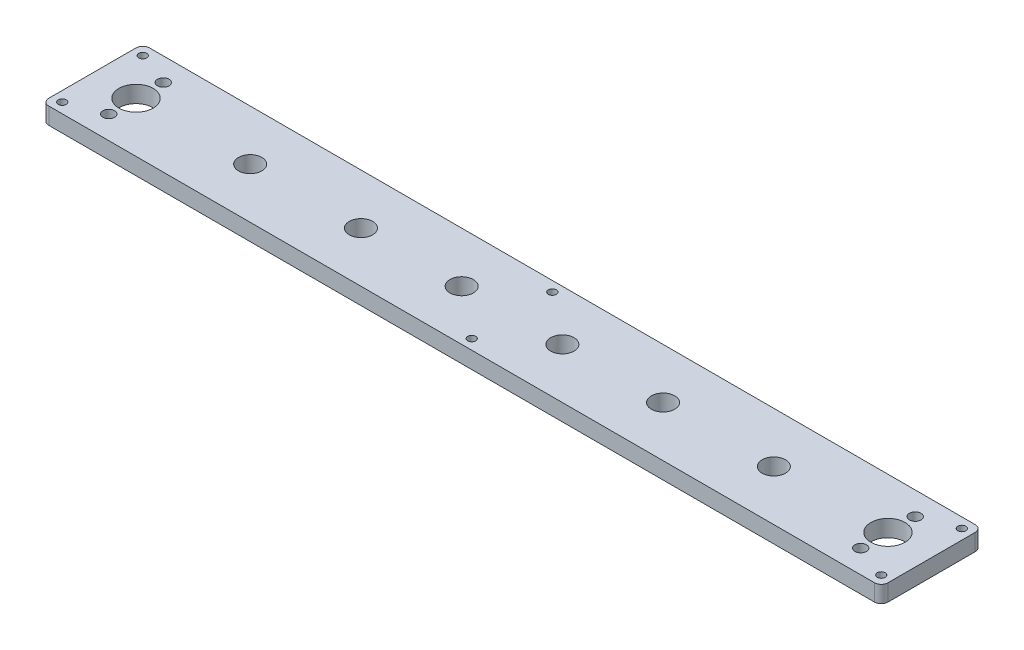
ISO-10303-21;
HEADER;
FILE_DESCRIPTION(('STEP AP214'),'2;1');
FILE_NAME('part.step','',(''),(''),'','','');
FILE_SCHEMA(('AUTOMOTIVE_DESIGN { 1 0 10303 214 1 1 1 1 }'));
ENDSEC;
DATA;
#1=APPLICATION_CONTEXT('core data for automotive mechanical design processes');
#2=APPLICATION_PROTOCOL_DEFINITION('international standard','automotive_design',2000,#1);
#3=PRODUCT_CONTEXT('',#1,'mechanical');
#4=PRODUCT('Part','Part','',(#3));
#5=PRODUCT_RELATED_PRODUCT_CATEGORY('part','',(#4));
#6=PRODUCT_DEFINITION_FORMATION('','',#4);
#7=PRODUCT_DEFINITION_CONTEXT('part definition',#1,'design');
#8=PRODUCT_DEFINITION('design','',#6,#7);
#9=PRODUCT_DEFINITION_SHAPE('','',#8);
#10=(LENGTH_UNIT() NAMED_UNIT(*) SI_UNIT(.MILLI.,.METRE.));
#11=(NAMED_UNIT(*) PLANE_ANGLE_UNIT() SI_UNIT($,.RADIAN.));
#12=(NAMED_UNIT(*) SI_UNIT($,.STERADIAN.) SOLID_ANGLE_UNIT());
#13=UNCERTAINTY_MEASURE_WITH_UNIT(LENGTH_MEASURE(1.E-05),#10,'distance_accuracy_value','');
#14=(GEOMETRIC_REPRESENTATION_CONTEXT(3) GLOBAL_UNCERTAINTY_ASSIGNED_CONTEXT((#13)) GLOBAL_UNIT_ASSIGNED_CONTEXT((#10,
#11,#12)) REPRESENTATION_CONTEXT('',''));
#15=CARTESIAN_POINT('',(0.,0.,0.));
#16=DIRECTION('',(0.,0.,1.));
#17=DIRECTION('',(1.,0.,0.));
#18=AXIS2_PLACEMENT_3D('',#15,#16,#17);
#19=CARTESIAN_POINT('',(158.75,3.175,19.05));
#20=DIRECTION('',(-1.,0.,0.));
#21=DIRECTION('',(0.,0.,1.));
#22=AXIS2_PLACEMENT_3D('',#19,#20,#21);
#23=PLANE('',#22);
#24=DIRECTION('',(0.,0.,-1.));
#25=VECTOR('',#24,1.);
#26=CARTESIAN_POINT('',(158.75,3.175,19.05));
#27=LINE('',#26,#25);
#28=CARTESIAN_POINT('',(158.75,3.175,16.51));
#29=VERTEX_POINT('',#28);
#30=CARTESIAN_POINT('',(158.75,3.175,-16.51));
#31=VERTEX_POINT('',#30);
#32=EDGE_CURVE('E125',#29,#31,#27,.T.);
#33=ORIENTED_EDGE('',*,*,#32,.F.);
#34=DIRECTION('',(0.,-1.,0.));
#35=VECTOR('',#34,1.);
#36=CARTESIAN_POINT('',(158.75,3.175,16.51));
#37=LINE('',#36,#35);
#38=CARTESIAN_POINT('',(158.75,-3.175,16.51));
#39=VERTEX_POINT('',#38);
#40=EDGE_CURVE('E110',#29,#39,#37,.T.);
#41=ORIENTED_EDGE('',*,*,#40,.T.);
#42=DIRECTION('',(0.,0.,-1.));
#43=VECTOR('',#42,1.);
#44=CARTESIAN_POINT('',(158.75,-3.175,19.05));
#45=LINE('',#44,#43);
#46=CARTESIAN_POINT('',(158.75,-3.175,-16.51));
#47=VERTEX_POINT('',#46);
#48=EDGE_CURVE('E122',#39,#47,#45,.T.);
#49=ORIENTED_EDGE('',*,*,#48,.T.);
#50=DIRECTION('',(0.,-1.,0.));
#51=VECTOR('',#50,1.);
#52=CARTESIAN_POINT('',(158.75,3.175,-16.51));
#53=LINE('',#52,#51);
#54=EDGE_CURVE('E127',#47,#31,#53,.F.);
#55=ORIENTED_EDGE('',*,*,#54,.T.);
#56=EDGE_LOOP('',(#33,#41,#49,#55));
#57=FACE_BOUND('',#56,.T.);
#58=ADVANCED_FACE('F39',(#57),#23,.F.);
#59=CARTESIAN_POINT('',(-158.75,3.175,-19.05));
#60=DIRECTION('',(0.,0.,1.));
#61=DIRECTION('',(1.,0.,0.));
#62=AXIS2_PLACEMENT_3D('',#59,#60,#61);
#63=PLANE('',#62);
#64=DIRECTION('',(-1.,0.,0.));
#65=VECTOR('',#64,1.);
#66=CARTESIAN_POINT('',(-158.75,3.175,-19.05));
#67=LINE('',#66,#65);
#68=CARTESIAN_POINT('',(156.21,3.175,-19.05));
#69=VERTEX_POINT('',#68);
#70=CARTESIAN_POINT('',(-156.21,3.175,-19.05));
#71=VERTEX_POINT('',#70);
#72=EDGE_CURVE('E169',#69,#71,#67,.T.);
#73=ORIENTED_EDGE('',*,*,#72,.F.);
#74=DIRECTION('',(0.,-1.,0.));
#75=VECTOR('',#74,1.);
#76=CARTESIAN_POINT('',(156.21,3.175,-19.05));
#77=LINE('',#76,#75);
#78=CARTESIAN_POINT('',(156.21,-3.175,-19.05));
#79=VERTEX_POINT('',#78);
#80=EDGE_CURVE('E11',#69,#79,#77,.T.);
#81=ORIENTED_EDGE('',*,*,#80,.T.);
#82=DIRECTION('',(-1.,0.,0.));
#83=VECTOR('',#82,1.);
#84=CARTESIAN_POINT('',(-158.75,-3.175,-19.05));
#85=LINE('',#84,#83);
#86=CARTESIAN_POINT('',(-156.21,-3.175,-19.05));
#87=VERTEX_POINT('',#86);
#88=EDGE_CURVE('E132',#79,#87,#85,.T.);
#89=ORIENTED_EDGE('',*,*,#88,.T.);
#90=DIRECTION('',(0.,-1.,0.));
#91=VECTOR('',#90,1.);
#92=CARTESIAN_POINT('',(-156.21,3.175,-19.05));
#93=LINE('',#92,#91);
#94=EDGE_CURVE('E47',#87,#71,#93,.F.);
#95=ORIENTED_EDGE('',*,*,#94,.T.);
#96=EDGE_LOOP('',(#73,#81,#89,#95));
#97=FACE_BOUND('',#96,.T.);
#98=ADVANCED_FACE('F168',(#97),#63,.F.);
#99=CARTESIAN_POINT('',(-158.75,3.175,19.05));
#100=DIRECTION('',(1.,0.,0.));
#101=DIRECTION('',(0.,0.,-1.));
#102=AXIS2_PLACEMENT_3D('',#99,#100,#101);
#103=PLANE('',#102);
#104=DIRECTION('',(0.,0.,1.));
#105=VECTOR('',#104,1.);
#106=CARTESIAN_POINT('',(-158.75,-3.175,19.05));
#107=LINE('',#106,#105);
#108=CARTESIAN_POINT('',(-158.75,-3.175,-16.51));
#109=VERTEX_POINT('',#108);
#110=CARTESIAN_POINT('',(-158.75,-3.175,16.51));
#111=VERTEX_POINT('',#110);
#112=EDGE_CURVE('E136',#109,#111,#107,.T.);
#113=ORIENTED_EDGE('',*,*,#112,.T.);
#114=DIRECTION('',(0.,-1.,0.));
#115=VECTOR('',#114,1.);
#116=CARTESIAN_POINT('',(-158.75,3.175,16.51));
#117=LINE('',#116,#115);
#118=CARTESIAN_POINT('',(-158.75,3.175,16.51));
#119=VERTEX_POINT('',#118);
#120=EDGE_CURVE('E54',#111,#119,#117,.F.);
#121=ORIENTED_EDGE('',*,*,#120,.T.);
#122=DIRECTION('',(0.,0.,1.));
#123=VECTOR('',#122,1.);
#124=CARTESIAN_POINT('',(-158.75,3.175,19.05));
#125=LINE('',#124,#123);
#126=CARTESIAN_POINT('',(-158.75,3.175,-16.51));
#127=VERTEX_POINT('',#126);
#128=EDGE_CURVE('E175',#127,#119,#125,.T.);
#129=ORIENTED_EDGE('',*,*,#128,.F.);
#130=DIRECTION('',(0.,-1.,0.));
#131=VECTOR('',#130,1.);
#132=CARTESIAN_POINT('',(-158.75,3.175,-16.51));
#133=LINE('',#132,#131);
#134=EDGE_CURVE('E162',#127,#109,#133,.T.);
#135=ORIENTED_EDGE('',*,*,#134,.T.);
#136=EDGE_LOOP('',(#113,#121,#129,#135));
#137=FACE_BOUND('',#136,.T.);
#138=ADVANCED_FACE('F179',(#137),#103,.F.);
#139=CARTESIAN_POINT('',(-158.75,3.175,19.05));
#140=DIRECTION('',(0.,0.,-1.));
#141=DIRECTION('',(-1.,0.,0.));
#142=AXIS2_PLACEMENT_3D('',#139,#140,#141);
#143=PLANE('',#142);
#144=DIRECTION('',(1.,0.,0.));
#145=VECTOR('',#144,1.);
#146=CARTESIAN_POINT('',(-158.75,-3.175,19.05));
#147=LINE('',#146,#145);
#148=CARTESIAN_POINT('',(-156.21,-3.175,19.05));
#149=VERTEX_POINT('',#148);
#150=CARTESIAN_POINT('',(156.21,-3.175,19.05));
#151=VERTEX_POINT('',#150);
#152=EDGE_CURVE('E146',#149,#151,#147,.T.);
#153=ORIENTED_EDGE('',*,*,#152,.T.);
#154=DIRECTION('',(0.,-1.,0.));
#155=VECTOR('',#154,1.);
#156=CARTESIAN_POINT('',(156.21,3.175,19.05));
#157=LINE('',#156,#155);
#158=CARTESIAN_POINT('',(156.21,3.175,19.05));
#159=VERTEX_POINT('',#158);
#160=EDGE_CURVE('E111',#151,#159,#157,.F.);
#161=ORIENTED_EDGE('',*,*,#160,.T.);
#162=DIRECTION('',(1.,0.,0.));
#163=VECTOR('',#162,1.);
#164=CARTESIAN_POINT('',(-158.75,3.175,19.05));
#165=LINE('',#164,#163);
#166=CARTESIAN_POINT('',(-156.21,3.175,19.05));
#167=VERTEX_POINT('',#166);
#168=EDGE_CURVE('E142',#167,#159,#165,.T.);
#169=ORIENTED_EDGE('',*,*,#168,.F.);
#170=DIRECTION('',(0.,-1.,0.));
#171=VECTOR('',#170,1.);
#172=CARTESIAN_POINT('',(-156.21,3.175,19.05));
#173=LINE('',#172,#171);
#174=EDGE_CURVE('E116',#167,#149,#173,.T.);
#175=ORIENTED_EDGE('',*,*,#174,.T.);
#176=EDGE_LOOP('',(#153,#161,#169,#175));
#177=FACE_BOUND('',#176,.T.);
#178=ADVANCED_FACE('F186',(#177),#143,.F.);
#179=CARTESIAN_POINT('',(0.,3.175,0.));
#180=DIRECTION('',(0.,-1.,0.));
#181=DIRECTION('',(0.,0.,-1.));
#182=AXIS2_PLACEMENT_3D('',#179,#180,#181);
#183=PLANE('',#182);
#184=CARTESIAN_POINT('',(0.,3.175,15.24));
#185=DIRECTION('',(0.,1.,0.));
#186=DIRECTION('',(0.,0.,1.));
#187=AXIS2_PLACEMENT_3D('',#184,#185,#186);
#188=CIRCLE('',#187,1.5113);
#189=CARTESIAN_POINT('',(0.,3.175,16.7513));
#190=VERTEX_POINT('',#189);
#191=EDGE_CURVE('E276',#190,#190,#188,.T.);
#192=ORIENTED_EDGE('',*,*,#191,.F.);
#193=EDGE_LOOP('',(#192));
#194=FACE_BOUND('',#193,.T.);
#195=CARTESIAN_POINT('',(0.,3.175,-15.24));
#196=DIRECTION('',(0.,1.,0.));
#197=DIRECTION('',(0.,0.,1.));
#198=AXIS2_PLACEMENT_3D('',#195,#196,#197);
#199=CIRCLE('',#198,1.5113);
#200=CARTESIAN_POINT('',(0.,3.175,-13.7287));
#201=VERTEX_POINT('',#200);
#202=EDGE_CURVE('E282',#201,#201,#199,.T.);
#203=ORIENTED_EDGE('',*,*,#202,.F.);
#204=EDGE_LOOP('',(#203));
#205=FACE_BOUND('',#204,.T.);
#206=CARTESIAN_POINT('',(154.94,3.175,-15.24));
#207=DIRECTION('',(0.,1.,0.));
#208=DIRECTION('',(0.,0.,1.));
#209=AXIS2_PLACEMENT_3D('',#206,#207,#208);
#210=CIRCLE('',#209,1.5113);
#211=CARTESIAN_POINT('',(154.94,3.175,-13.7287));
#212=VERTEX_POINT('',#211);
#213=EDGE_CURVE('E288',#212,#212,#210,.T.);
#214=ORIENTED_EDGE('',*,*,#213,.F.);
#215=EDGE_LOOP('',(#214));
#216=FACE_BOUND('',#215,.T.);
#217=CARTESIAN_POINT('',(154.94,3.175,15.24));
#218=DIRECTION('',(0.,1.,0.));
#219=DIRECTION('',(0.,0.,1.));
#220=AXIS2_PLACEMENT_3D('',#217,#218,#219);
#221=CIRCLE('',#220,1.5113);
#222=CARTESIAN_POINT('',(154.94,3.175,16.7513));
#223=VERTEX_POINT('',#222);
#224=EDGE_CURVE('E264',#223,#223,#221,.T.);
#225=ORIENTED_EDGE('',*,*,#224,.F.);
#226=EDGE_LOOP('',(#225));
#227=FACE_BOUND('',#226,.T.);
#228=CARTESIAN_POINT('',(-154.94,3.175,15.24));
#229=DIRECTION('',(0.,1.,0.));
#230=DIRECTION('',(0.,0.,1.));
#231=AXIS2_PLACEMENT_3D('',#228,#229,#230);
#232=CIRCLE('',#231,1.5113);
#233=CARTESIAN_POINT('',(-154.94,3.175,16.7513));
#234=VERTEX_POINT('',#233);
#235=EDGE_CURVE('E271',#234,#234,#232,.T.);
#236=ORIENTED_EDGE('',*,*,#235,.F.);
#237=EDGE_LOOP('',(#236));
#238=FACE_BOUND('',#237,.T.);
#239=CARTESIAN_POINT('',(-154.94,3.175,-15.24));
#240=DIRECTION('',(0.,1.,0.));
#241=DIRECTION('',(0.,0.,1.));
#242=AXIS2_PLACEMENT_3D('',#239,#240,#241);
#243=CIRCLE('',#242,1.5113);
#244=CARTESIAN_POINT('',(-154.94,3.175,-13.7287));
#245=VERTEX_POINT('',#244);
#246=EDGE_CURVE('E258',#245,#245,#243,.T.);
#247=ORIENTED_EDGE('',*,*,#246,.F.);
#248=EDGE_LOOP('',(#247));
#249=FACE_BOUND('',#248,.T.);
#250=CARTESIAN_POINT('',(142.24,3.175,0.));
#251=DIRECTION('',(0.,1.,0.));
#252=DIRECTION('',(0.,0.,1.));
#253=AXIS2_PLACEMENT_3D('',#250,#251,#252);
#254=CIRCLE('',#253,6.47700000000001);
#255=CARTESIAN_POINT('',(142.24,3.175,6.47700000000001));
#256=VERTEX_POINT('',#255);
#257=EDGE_CURVE('E222',#256,#256,#254,.T.);
#258=ORIENTED_EDGE('',*,*,#257,.F.);
#259=EDGE_LOOP('',(#258));
#260=FACE_BOUND('',#259,.T.);
#261=CARTESIAN_POINT('',(142.24,3.175,10.31875));
#262=DIRECTION('',(0.,1.,0.));
#263=DIRECTION('',(0.,0.,1.));
#264=AXIS2_PLACEMENT_3D('',#261,#262,#263);
#265=CIRCLE('',#264,2.19075000000001);
#266=CARTESIAN_POINT('',(142.24,3.175,12.5095));
#267=VERTEX_POINT('',#266);
#268=EDGE_CURVE('E237',#267,#267,#265,.T.);
#269=ORIENTED_EDGE('',*,*,#268,.F.);
#270=EDGE_LOOP('',(#269));
#271=FACE_BOUND('',#270,.T.);
#272=CARTESIAN_POINT('',(142.24,3.175,-10.31875));
#273=DIRECTION('',(0.,1.,0.));
#274=DIRECTION('',(0.,0.,1.));
#275=AXIS2_PLACEMENT_3D('',#272,#273,#274);
#276=CIRCLE('',#275,2.19075000000001);
#277=CARTESIAN_POINT('',(142.24,3.175,-8.12799999999999));
#278=VERTEX_POINT('',#277);
#279=EDGE_CURVE('E230',#278,#278,#276,.T.);
#280=ORIENTED_EDGE('',*,*,#279,.F.);
#281=EDGE_LOOP('',(#280));
#282=FACE_BOUND('',#281,.T.);
#283=CARTESIAN_POINT('',(-142.24,3.175,0.));
#284=DIRECTION('',(0.,1.,0.));
#285=DIRECTION('',(0.,0.,1.));
#286=AXIS2_PLACEMENT_3D('',#283,#284,#285);
#287=CIRCLE('',#286,6.47699999999998);
#288=CARTESIAN_POINT('',(-142.24,3.175,6.47699999999998));
#289=VERTEX_POINT('',#288);
#290=EDGE_CURVE('E242',#289,#289,#287,.T.);
#291=ORIENTED_EDGE('',*,*,#290,.F.);
#292=EDGE_LOOP('',(#291));
#293=FACE_BOUND('',#292,.T.);
#294=CARTESIAN_POINT('',(-142.24,3.175,10.31875));
#295=DIRECTION('',(0.,1.,0.));
#296=DIRECTION('',(0.,0.,1.));
#297=AXIS2_PLACEMENT_3D('',#294,#295,#296);
#298=CIRCLE('',#297,2.19075000000001);
#299=CARTESIAN_POINT('',(-142.24,3.175,12.5095));
#300=VERTEX_POINT('',#299);
#301=EDGE_CURVE('E253',#300,#300,#298,.T.);
#302=ORIENTED_EDGE('',*,*,#301,.F.);
#303=EDGE_LOOP('',(#302));
#304=FACE_BOUND('',#303,.T.);
#305=CARTESIAN_POINT('',(-142.24,3.175,-10.31875));
#306=DIRECTION('',(0.,1.,0.));
#307=DIRECTION('',(0.,0.,1.));
#308=AXIS2_PLACEMENT_3D('',#305,#306,#307);
#309=CIRCLE('',#308,2.19075000000001);
#310=CARTESIAN_POINT('',(-142.24,3.175,-8.12799999999999));
#311=VERTEX_POINT('',#310);
#312=EDGE_CURVE('E229',#311,#311,#309,.T.);
#313=ORIENTED_EDGE('',*,*,#312,.F.);
#314=EDGE_LOOP('',(#313));
#315=FACE_BOUND('',#314,.T.);
#316=CARTESIAN_POINT('',(99.06,3.175,0.));
#317=DIRECTION('',(0.,1.,0.));
#318=DIRECTION('',(0.,0.,1.));
#319=AXIS2_PLACEMENT_3D('',#316,#317,#318);
#320=CIRCLE('',#319,4.4196);
#321=CARTESIAN_POINT('',(99.06,3.175,4.4196));
#322=VERTEX_POINT('',#321);
#323=EDGE_CURVE('E192',#322,#322,#320,.T.);
#324=ORIENTED_EDGE('',*,*,#323,.F.);
#325=EDGE_LOOP('',(#324));
#326=FACE_BOUND('',#325,.T.);
#327=CARTESIAN_POINT('',(57.15,3.175,0.));
#328=DIRECTION('',(0.,1.,0.));
#329=DIRECTION('',(0.,0.,1.));
#330=AXIS2_PLACEMENT_3D('',#327,#328,#329);
#331=CIRCLE('',#330,4.4196);
#332=CARTESIAN_POINT('',(57.15,3.175,4.4196));
#333=VERTEX_POINT('',#332);
#334=EDGE_CURVE('E199',#333,#333,#331,.T.);
#335=ORIENTED_EDGE('',*,*,#334,.F.);
#336=EDGE_LOOP('',(#335));
#337=FACE_BOUND('',#336,.T.);
#338=CARTESIAN_POINT('',(19.05,3.175,0.));
#339=DIRECTION('',(0.,1.,0.));
#340=DIRECTION('',(0.,0.,1.));
#341=AXIS2_PLACEMENT_3D('',#338,#339,#340);
#342=CIRCLE('',#341,4.4196);
#343=CARTESIAN_POINT('',(19.05,3.175,4.4196));
#344=VERTEX_POINT('',#343);
#345=EDGE_CURVE('E205',#344,#344,#342,.T.);
#346=ORIENTED_EDGE('',*,*,#345,.F.);
#347=EDGE_LOOP('',(#346));
#348=FACE_BOUND('',#347,.T.);
#349=CARTESIAN_POINT('',(-19.05,3.175,0.));
#350=DIRECTION('',(0.,1.,0.));
#351=DIRECTION('',(0.,0.,1.));
#352=AXIS2_PLACEMENT_3D('',#349,#350,#351);
#353=CIRCLE('',#352,4.4196);
#354=CARTESIAN_POINT('',(-19.05,3.175,4.4196));
#355=VERTEX_POINT('',#354);
#356=EDGE_CURVE('E211',#355,#355,#353,.T.);
#357=ORIENTED_EDGE('',*,*,#356,.F.);
#358=EDGE_LOOP('',(#357));
#359=FACE_BOUND('',#358,.T.);
#360=CARTESIAN_POINT('',(-57.15,3.175,0.));
#361=DIRECTION('',(0.,1.,0.));
#362=DIRECTION('',(0.,0.,1.));
#363=AXIS2_PLACEMENT_3D('',#360,#361,#362);
#364=CIRCLE('',#363,4.4196);
#365=CARTESIAN_POINT('',(-57.15,3.175,4.4196));
#366=VERTEX_POINT('',#365);
#367=EDGE_CURVE('E217',#366,#366,#364,.T.);
#368=ORIENTED_EDGE('',*,*,#367,.F.);
#369=EDGE_LOOP('',(#368));
#370=FACE_BOUND('',#369,.T.);
#371=CARTESIAN_POINT('',(-99.06,3.175,0.));
#372=DIRECTION('',(0.,1.,0.));
#373=DIRECTION('',(0.,0.,1.));
#374=AXIS2_PLACEMENT_3D('',#371,#372,#373);
#375=CIRCLE('',#374,4.4196);
#376=CARTESIAN_POINT('',(-99.06,3.175,4.4196));
#377=VERTEX_POINT('',#376);
#378=EDGE_CURVE('E139',#377,#377,#375,.T.);
#379=ORIENTED_EDGE('',*,*,#378,.F.);
#380=EDGE_LOOP('',(#379));
#381=FACE_BOUND('',#380,.T.);
#382=ORIENTED_EDGE('',*,*,#168,.T.);
#383=CARTESIAN_POINT('',(156.21,3.175,16.51));
#384=DIRECTION('',(0.,-1.,0.));
#385=DIRECTION('',(0.,0.,-1.));
#386=AXIS2_PLACEMENT_3D('',#383,#384,#385);
#387=CIRCLE('',#386,2.54);
#388=EDGE_CURVE('E160',#159,#29,#387,.F.);
#389=ORIENTED_EDGE('',*,*,#388,.T.);
#390=ORIENTED_EDGE('',*,*,#32,.T.);
#391=CARTESIAN_POINT('',(156.21,3.175,-16.51));
#392=DIRECTION('',(0.,-1.,0.));
#393=DIRECTION('',(0.,0.,-1.));
#394=AXIS2_PLACEMENT_3D('',#391,#392,#393);
#395=CIRCLE('',#394,2.54);
#396=EDGE_CURVE('E156',#31,#69,#395,.F.);
#397=ORIENTED_EDGE('',*,*,#396,.T.);
#398=ORIENTED_EDGE('',*,*,#72,.T.);
#399=CARTESIAN_POINT('',(-156.21,3.175,-16.51));
#400=DIRECTION('',(0.,-1.,0.));
#401=DIRECTION('',(0.,0.,-1.));
#402=AXIS2_PLACEMENT_3D('',#399,#400,#401);
#403=CIRCLE('',#402,2.54);
#404=EDGE_CURVE('E61',#71,#127,#403,.F.);
#405=ORIENTED_EDGE('',*,*,#404,.T.);
#406=ORIENTED_EDGE('',*,*,#128,.T.);
#407=CARTESIAN_POINT('',(-156.21,3.175,16.51));
#408=DIRECTION('',(0.,-1.,0.));
#409=DIRECTION('',(0.,0.,-1.));
#410=AXIS2_PLACEMENT_3D('',#407,#408,#409);
#411=CIRCLE('',#410,2.54);
#412=EDGE_CURVE('E158',#119,#167,#411,.F.);
#413=ORIENTED_EDGE('',*,*,#412,.T.);
#414=EDGE_LOOP('',(#382,#389,#390,#397,#398,#405,#406,#413));
#415=FACE_BOUND('',#414,.T.);
#416=ADVANCED_FACE('F173',(#194,#205,#216,#227,#238,#249,#260,#271,#282,#293,#304,#315,#326,
#337,#348,#359,#370,#381,#415),#183,.F.);
#417=CARTESIAN_POINT('',(0.,-3.175,0.));
#418=DIRECTION('',(0.,-1.,0.));
#419=DIRECTION('',(0.,0.,-1.));
#420=AXIS2_PLACEMENT_3D('',#417,#418,#419);
#421=PLANE('',#420);
#422=CARTESIAN_POINT('',(0.,-3.175,15.24));
#423=DIRECTION('',(0.,1.,0.));
#424=DIRECTION('',(0.,0.,1.));
#425=AXIS2_PLACEMENT_3D('',#422,#423,#424);
#426=CIRCLE('',#425,1.5113);
#427=CARTESIAN_POINT('',(0.,-3.175,16.7513));
#428=VERTEX_POINT('',#427);
#429=EDGE_CURVE('E279',#428,#428,#426,.T.);
#430=ORIENTED_EDGE('',*,*,#429,.T.);
#431=EDGE_LOOP('',(#430));
#432=FACE_BOUND('',#431,.T.);
#433=CARTESIAN_POINT('',(0.,-3.175,-15.24));
#434=DIRECTION('',(0.,1.,0.));
#435=DIRECTION('',(0.,0.,1.));
#436=AXIS2_PLACEMENT_3D('',#433,#434,#435);
#437=CIRCLE('',#436,1.5113);
#438=CARTESIAN_POINT('',(0.,-3.175,-13.7287));
#439=VERTEX_POINT('',#438);
#440=EDGE_CURVE('E285',#439,#439,#437,.T.);
#441=ORIENTED_EDGE('',*,*,#440,.T.);
#442=EDGE_LOOP('',(#441));
#443=FACE_BOUND('',#442,.T.);
#444=CARTESIAN_POINT('',(154.94,-3.175,-15.24));
#445=DIRECTION('',(0.,1.,0.));
#446=DIRECTION('',(0.,0.,1.));
#447=AXIS2_PLACEMENT_3D('',#444,#445,#446);
#448=CIRCLE('',#447,1.5113);
#449=CARTESIAN_POINT('',(154.94,-3.175,-13.7287));
#450=VERTEX_POINT('',#449);
#451=EDGE_CURVE('E268',#450,#450,#448,.T.);
#452=ORIENTED_EDGE('',*,*,#451,.T.);
#453=EDGE_LOOP('',(#452));
#454=FACE_BOUND('',#453,.T.);
#455=CARTESIAN_POINT('',(154.94,-3.175,15.24));
#456=DIRECTION('',(0.,1.,0.));
#457=DIRECTION('',(0.,0.,1.));
#458=AXIS2_PLACEMENT_3D('',#455,#456,#457);
#459=CIRCLE('',#458,1.5113);
#460=CARTESIAN_POINT('',(154.94,-3.175,16.7513));
#461=VERTEX_POINT('',#460);
#462=EDGE_CURVE('E267',#461,#461,#459,.T.);
#463=ORIENTED_EDGE('',*,*,#462,.T.);
#464=EDGE_LOOP('',(#463));
#465=FACE_BOUND('',#464,.T.);
#466=CARTESIAN_POINT('',(-154.94,-3.175,15.24));
#467=DIRECTION('',(0.,1.,0.));
#468=DIRECTION('',(0.,0.,1.));
#469=AXIS2_PLACEMENT_3D('',#466,#467,#468);
#470=CIRCLE('',#469,1.5113);
#471=CARTESIAN_POINT('',(-154.94,-3.175,16.7513));
#472=VERTEX_POINT('',#471);
#473=EDGE_CURVE('E261',#472,#472,#470,.T.);
#474=ORIENTED_EDGE('',*,*,#473,.T.);
#475=EDGE_LOOP('',(#474));
#476=FACE_BOUND('',#475,.T.);
#477=CARTESIAN_POINT('',(-154.94,-3.175,-15.24));
#478=DIRECTION('',(0.,1.,0.));
#479=DIRECTION('',(0.,0.,1.));
#480=AXIS2_PLACEMENT_3D('',#477,#478,#479);
#481=CIRCLE('',#480,1.5113);
#482=CARTESIAN_POINT('',(-154.94,-3.175,-13.7287));
#483=VERTEX_POINT('',#482);
#484=EDGE_CURVE('E234',#483,#483,#481,.T.);
#485=ORIENTED_EDGE('',*,*,#484,.T.);
#486=EDGE_LOOP('',(#485));
#487=FACE_BOUND('',#486,.T.);
#488=CARTESIAN_POINT('',(142.24,-3.175,0.));
#489=DIRECTION('',(0.,1.,0.));
#490=DIRECTION('',(0.,0.,1.));
#491=AXIS2_PLACEMENT_3D('',#488,#489,#490);
#492=CIRCLE('',#491,6.47700000000001);
#493=CARTESIAN_POINT('',(142.24,-3.175,6.47700000000001));
#494=VERTEX_POINT('',#493);
#495=EDGE_CURVE('E225',#494,#494,#492,.T.);
#496=ORIENTED_EDGE('',*,*,#495,.T.);
#497=EDGE_LOOP('',(#496));
#498=FACE_BOUND('',#497,.T.);
#499=CARTESIAN_POINT('',(142.24,-3.175,10.31875));
#500=DIRECTION('',(0.,1.,0.));
#501=DIRECTION('',(0.,0.,1.));
#502=AXIS2_PLACEMENT_3D('',#499,#500,#501);
#503=CIRCLE('',#502,2.19075000000001);
#504=CARTESIAN_POINT('',(142.24,-3.175,12.5095));
#505=VERTEX_POINT('',#504);
#506=EDGE_CURVE('E226',#505,#505,#503,.T.);
#507=ORIENTED_EDGE('',*,*,#506,.T.);
#508=EDGE_LOOP('',(#507));
#509=FACE_BOUND('',#508,.T.);
#510=CARTESIAN_POINT('',(142.24,-3.175,-10.31875));
#511=DIRECTION('',(0.,1.,0.));
#512=DIRECTION('',(0.,0.,1.));
#513=AXIS2_PLACEMENT_3D('',#510,#511,#512);
#514=CIRCLE('',#513,2.19075000000001);
#515=CARTESIAN_POINT('',(142.24,-3.175,-8.12799999999999));
#516=VERTEX_POINT('',#515);
#517=EDGE_CURVE('E233',#516,#516,#514,.T.);
#518=ORIENTED_EDGE('',*,*,#517,.T.);
#519=EDGE_LOOP('',(#518));
#520=FACE_BOUND('',#519,.T.);
#521=CARTESIAN_POINT('',(-142.24,-3.175,0.));
#522=DIRECTION('',(0.,1.,0.));
#523=DIRECTION('',(0.,0.,1.));
#524=AXIS2_PLACEMENT_3D('',#521,#522,#523);
#525=CIRCLE('',#524,6.47699999999998);
#526=CARTESIAN_POINT('',(-142.24,-3.175,6.47699999999998));
#527=VERTEX_POINT('',#526);
#528=EDGE_CURVE('E196',#527,#527,#525,.T.);
#529=ORIENTED_EDGE('',*,*,#528,.T.);
#530=EDGE_LOOP('',(#529));
#531=FACE_BOUND('',#530,.T.);
#532=CARTESIAN_POINT('',(-142.24,-3.175,10.31875));
#533=DIRECTION('',(0.,1.,0.));
#534=DIRECTION('',(0.,0.,1.));
#535=AXIS2_PLACEMENT_3D('',#532,#533,#534);
#536=CIRCLE('',#535,2.19075000000001);
#537=CARTESIAN_POINT('',(-142.24,-3.175,12.5095));
#538=VERTEX_POINT('',#537);
#539=EDGE_CURVE('E245',#538,#538,#536,.T.);
#540=ORIENTED_EDGE('',*,*,#539,.T.);
#541=EDGE_LOOP('',(#540));
#542=FACE_BOUND('',#541,.T.);
#543=CARTESIAN_POINT('',(-142.24,-3.175,-10.31875));
#544=DIRECTION('',(0.,1.,0.));
#545=DIRECTION('',(0.,0.,1.));
#546=AXIS2_PLACEMENT_3D('',#543,#544,#545);
#547=CIRCLE('',#546,2.19075000000001);
#548=CARTESIAN_POINT('',(-142.24,-3.175,-8.12799999999999));
#549=VERTEX_POINT('',#548);
#550=EDGE_CURVE('E250',#549,#549,#547,.T.);
#551=ORIENTED_EDGE('',*,*,#550,.T.);
#552=EDGE_LOOP('',(#551));
#553=FACE_BOUND('',#552,.T.);
#554=CARTESIAN_POINT('',(99.06,-3.175,0.));
#555=DIRECTION('',(0.,1.,0.));
#556=DIRECTION('',(0.,0.,1.));
#557=AXIS2_PLACEMENT_3D('',#554,#555,#556);
#558=CIRCLE('',#557,4.4196);
#559=CARTESIAN_POINT('',(99.06,-3.175,4.4196));
#560=VERTEX_POINT('',#559);
#561=EDGE_CURVE('E195',#560,#560,#558,.T.);
#562=ORIENTED_EDGE('',*,*,#561,.T.);
#563=EDGE_LOOP('',(#562));
#564=FACE_BOUND('',#563,.T.);
#565=CARTESIAN_POINT('',(57.15,-3.175,0.));
#566=DIRECTION('',(0.,1.,0.));
#567=DIRECTION('',(0.,0.,1.));
#568=AXIS2_PLACEMENT_3D('',#565,#566,#567);
#569=CIRCLE('',#568,4.4196);
#570=CARTESIAN_POINT('',(57.15,-3.175,4.4196));
#571=VERTEX_POINT('',#570);
#572=EDGE_CURVE('E202',#571,#571,#569,.T.);
#573=ORIENTED_EDGE('',*,*,#572,.T.);
#574=EDGE_LOOP('',(#573));
#575=FACE_BOUND('',#574,.T.);
#576=CARTESIAN_POINT('',(19.05,-3.175,0.));
#577=DIRECTION('',(0.,1.,0.));
#578=DIRECTION('',(0.,0.,1.));
#579=AXIS2_PLACEMENT_3D('',#576,#577,#578);
#580=CIRCLE('',#579,4.4196);
#581=CARTESIAN_POINT('',(19.05,-3.175,4.4196));
#582=VERTEX_POINT('',#581);
#583=EDGE_CURVE('E208',#582,#582,#580,.T.);
#584=ORIENTED_EDGE('',*,*,#583,.T.);
#585=EDGE_LOOP('',(#584));
#586=FACE_BOUND('',#585,.T.);
#587=CARTESIAN_POINT('',(-19.05,-3.175,0.));
#588=DIRECTION('',(0.,1.,0.));
#589=DIRECTION('',(0.,0.,1.));
#590=AXIS2_PLACEMENT_3D('',#587,#588,#589);
#591=CIRCLE('',#590,4.4196);
#592=CARTESIAN_POINT('',(-19.05,-3.175,4.4196));
#593=VERTEX_POINT('',#592);
#594=EDGE_CURVE('E214',#593,#593,#591,.T.);
#595=ORIENTED_EDGE('',*,*,#594,.T.);
#596=EDGE_LOOP('',(#595));
#597=FACE_BOUND('',#596,.T.);
#598=CARTESIAN_POINT('',(-57.15,-3.175,0.));
#599=DIRECTION('',(0.,1.,0.));
#600=DIRECTION('',(0.,0.,1.));
#601=AXIS2_PLACEMENT_3D('',#598,#599,#600);
#602=CIRCLE('',#601,4.4196);
#603=CARTESIAN_POINT('',(-57.15,-3.175,4.4196));
#604=VERTEX_POINT('',#603);
#605=EDGE_CURVE('E190',#604,#604,#602,.T.);
#606=ORIENTED_EDGE('',*,*,#605,.T.);
#607=EDGE_LOOP('',(#606));
#608=FACE_BOUND('',#607,.T.);
#609=CARTESIAN_POINT('',(-99.06,-3.175,0.));
#610=DIRECTION('',(0.,1.,0.));
#611=DIRECTION('',(0.,0.,1.));
#612=AXIS2_PLACEMENT_3D('',#609,#610,#611);
#613=CIRCLE('',#612,4.4196);
#614=CARTESIAN_POINT('',(-99.06,-3.175,4.4196));
#615=VERTEX_POINT('',#614);
#616=EDGE_CURVE('E133',#615,#615,#613,.T.);
#617=ORIENTED_EDGE('',*,*,#616,.T.);
#618=EDGE_LOOP('',(#617));
#619=FACE_BOUND('',#618,.T.);
#620=ORIENTED_EDGE('',*,*,#48,.F.);
#621=CARTESIAN_POINT('',(156.21,-3.175,16.51));
#622=DIRECTION('',(0.,-1.,0.));
#623=DIRECTION('',(0.,0.,-1.));
#624=AXIS2_PLACEMENT_3D('',#621,#622,#623);
#625=CIRCLE('',#624,2.54);
#626=EDGE_CURVE('E106',#39,#151,#625,.T.);
#627=ORIENTED_EDGE('',*,*,#626,.T.);
#628=ORIENTED_EDGE('',*,*,#152,.F.);
#629=CARTESIAN_POINT('',(-156.21,-3.175,16.51));
#630=DIRECTION('',(0.,-1.,0.));
#631=DIRECTION('',(0.,0.,-1.));
#632=AXIS2_PLACEMENT_3D('',#629,#630,#631);
#633=CIRCLE('',#632,2.54);
#634=EDGE_CURVE('E117',#149,#111,#633,.T.);
#635=ORIENTED_EDGE('',*,*,#634,.T.);
#636=ORIENTED_EDGE('',*,*,#112,.F.);
#637=CARTESIAN_POINT('',(-156.21,-3.175,-16.51));
#638=DIRECTION('',(0.,-1.,0.));
#639=DIRECTION('',(0.,0.,-1.));
#640=AXIS2_PLACEMENT_3D('',#637,#638,#639);
#641=CIRCLE('',#640,2.54);
#642=EDGE_CURVE('E126',#109,#87,#641,.T.);
#643=ORIENTED_EDGE('',*,*,#642,.T.);
#644=ORIENTED_EDGE('',*,*,#88,.F.);
#645=CARTESIAN_POINT('',(156.21,-3.175,-16.51));
#646=DIRECTION('',(0.,-1.,0.));
#647=DIRECTION('',(0.,0.,-1.));
#648=AXIS2_PLACEMENT_3D('',#645,#646,#647);
#649=CIRCLE('',#648,2.54);
#650=EDGE_CURVE('E131',#79,#47,#649,.T.);
#651=ORIENTED_EDGE('',*,*,#650,.T.);
#652=EDGE_LOOP('',(#620,#627,#628,#635,#636,#643,#644,#651));
#653=FACE_BOUND('',#652,.T.);
#654=ADVANCED_FACE('F129',(#432,#443,#454,#465,#476,#487,#498,#509,#520,#531,#542,#553,#564,
#575,#586,#597,#608,#619,#653),#421,.T.);
#655=CARTESIAN_POINT('',(-99.06,-3.175,0.));
#656=DIRECTION('',(0.,1.,0.));
#657=DIRECTION('',(0.,0.,1.));
#658=AXIS2_PLACEMENT_3D('',#655,#656,#657);
#659=CYLINDRICAL_SURFACE('',#658,4.4196);
#660=ORIENTED_EDGE('',*,*,#616,.F.);
#661=EDGE_LOOP('',(#660));
#662=FACE_BOUND('',#661,.T.);
#663=ORIENTED_EDGE('',*,*,#378,.T.);
#664=EDGE_LOOP('',(#663));
#665=FACE_BOUND('',#664,.T.);
#666=ADVANCED_FACE('F338',(#662,#665),#659,.F.);
#667=CARTESIAN_POINT('',(-57.15,-3.175,0.));
#668=DIRECTION('',(0.,1.,0.));
#669=DIRECTION('',(0.,0.,1.));
#670=AXIS2_PLACEMENT_3D('',#667,#668,#669);
#671=CYLINDRICAL_SURFACE('',#670,4.4196);
#672=ORIENTED_EDGE('',*,*,#605,.F.);
#673=EDGE_LOOP('',(#672));
#674=FACE_BOUND('',#673,.T.);
#675=ORIENTED_EDGE('',*,*,#367,.T.);
#676=EDGE_LOOP('',(#675));
#677=FACE_BOUND('',#676,.T.);
#678=ADVANCED_FACE('F340',(#674,#677),#671,.F.);
#679=CARTESIAN_POINT('',(-19.05,-3.175,0.));
#680=DIRECTION('',(0.,1.,0.));
#681=DIRECTION('',(0.,0.,1.));
#682=AXIS2_PLACEMENT_3D('',#679,#680,#681);
#683=CYLINDRICAL_SURFACE('',#682,4.4196);
#684=ORIENTED_EDGE('',*,*,#594,.F.);
#685=EDGE_LOOP('',(#684));
#686=FACE_BOUND('',#685,.T.);
#687=ORIENTED_EDGE('',*,*,#356,.T.);
#688=EDGE_LOOP('',(#687));
#689=FACE_BOUND('',#688,.T.);
#690=ADVANCED_FACE('F347',(#686,#689),#683,.F.);
#691=CARTESIAN_POINT('',(19.05,-3.175,0.));
#692=DIRECTION('',(0.,1.,0.));
#693=DIRECTION('',(0.,0.,1.));
#694=AXIS2_PLACEMENT_3D('',#691,#692,#693);
#695=CYLINDRICAL_SURFACE('',#694,4.4196);
#696=ORIENTED_EDGE('',*,*,#583,.F.);
#697=EDGE_LOOP('',(#696));
#698=FACE_BOUND('',#697,.T.);
#699=ORIENTED_EDGE('',*,*,#345,.T.);
#700=EDGE_LOOP('',(#699));
#701=FACE_BOUND('',#700,.T.);
#702=ADVANCED_FACE('F560',(#698,#701),#695,.F.);
#703=CARTESIAN_POINT('',(57.15,-3.175,0.));
#704=DIRECTION('',(0.,1.,0.));
#705=DIRECTION('',(0.,0.,1.));
#706=AXIS2_PLACEMENT_3D('',#703,#704,#705);
#707=CYLINDRICAL_SURFACE('',#706,4.4196);
#708=ORIENTED_EDGE('',*,*,#572,.F.);
#709=EDGE_LOOP('',(#708));
#710=FACE_BOUND('',#709,.T.);
#711=ORIENTED_EDGE('',*,*,#334,.T.);
#712=EDGE_LOOP('',(#711));
#713=FACE_BOUND('',#712,.T.);
#714=ADVANCED_FACE('F551',(#710,#713),#707,.F.);
#715=CARTESIAN_POINT('',(99.06,-3.175,0.));
#716=DIRECTION('',(0.,1.,0.));
#717=DIRECTION('',(0.,0.,1.));
#718=AXIS2_PLACEMENT_3D('',#715,#716,#717);
#719=CYLINDRICAL_SURFACE('',#718,4.4196);
#720=ORIENTED_EDGE('',*,*,#561,.F.);
#721=EDGE_LOOP('',(#720));
#722=FACE_BOUND('',#721,.T.);
#723=ORIENTED_EDGE('',*,*,#323,.T.);
#724=EDGE_LOOP('',(#723));
#725=FACE_BOUND('',#724,.T.);
#726=ADVANCED_FACE('F541',(#722,#725),#719,.F.);
#727=CARTESIAN_POINT('',(-142.24,-3.175,-10.31875));
#728=DIRECTION('',(0.,1.,0.));
#729=DIRECTION('',(0.,0.,1.));
#730=AXIS2_PLACEMENT_3D('',#727,#728,#729);
#731=CYLINDRICAL_SURFACE('',#730,2.19075000000001);
#732=ORIENTED_EDGE('',*,*,#550,.F.);
#733=EDGE_LOOP('',(#732));
#734=FACE_BOUND('',#733,.T.);
#735=ORIENTED_EDGE('',*,*,#312,.T.);
#736=EDGE_LOOP('',(#735));
#737=FACE_BOUND('',#736,.T.);
#738=ADVANCED_FACE('F531',(#734,#737),#731,.F.);
#739=CARTESIAN_POINT('',(-142.24,-3.175,10.31875));
#740=DIRECTION('',(0.,1.,0.));
#741=DIRECTION('',(0.,0.,1.));
#742=AXIS2_PLACEMENT_3D('',#739,#740,#741);
#743=CYLINDRICAL_SURFACE('',#742,2.19075000000001);
#744=ORIENTED_EDGE('',*,*,#539,.F.);
#745=EDGE_LOOP('',(#744));
#746=FACE_BOUND('',#745,.T.);
#747=ORIENTED_EDGE('',*,*,#301,.T.);
#748=EDGE_LOOP('',(#747));
#749=FACE_BOUND('',#748,.T.);
#750=ADVANCED_FACE('F521',(#746,#749),#743,.F.);
#751=CARTESIAN_POINT('',(-142.24,-3.175,0.));
#752=DIRECTION('',(0.,1.,0.));
#753=DIRECTION('',(0.,0.,1.));
#754=AXIS2_PLACEMENT_3D('',#751,#752,#753);
#755=CYLINDRICAL_SURFACE('',#754,6.47699999999998);
#756=ORIENTED_EDGE('',*,*,#528,.F.);
#757=EDGE_LOOP('',(#756));
#758=FACE_BOUND('',#757,.T.);
#759=ORIENTED_EDGE('',*,*,#290,.T.);
#760=EDGE_LOOP('',(#759));
#761=FACE_BOUND('',#760,.T.);
#762=ADVANCED_FACE('F511',(#758,#761),#755,.F.);
#763=CARTESIAN_POINT('',(142.24,-3.175,-10.31875));
#764=DIRECTION('',(0.,1.,0.));
#765=DIRECTION('',(0.,0.,1.));
#766=AXIS2_PLACEMENT_3D('',#763,#764,#765);
#767=CYLINDRICAL_SURFACE('',#766,2.19075000000001);
#768=ORIENTED_EDGE('',*,*,#517,.F.);
#769=EDGE_LOOP('',(#768));
#770=FACE_BOUND('',#769,.T.);
#771=ORIENTED_EDGE('',*,*,#279,.T.);
#772=EDGE_LOOP('',(#771));
#773=FACE_BOUND('',#772,.T.);
#774=ADVANCED_FACE('F501',(#770,#773),#767,.F.);
#775=CARTESIAN_POINT('',(142.24,-3.175,10.31875));
#776=DIRECTION('',(0.,1.,0.));
#777=DIRECTION('',(0.,0.,1.));
#778=AXIS2_PLACEMENT_3D('',#775,#776,#777);
#779=CYLINDRICAL_SURFACE('',#778,2.19075000000001);
#780=ORIENTED_EDGE('',*,*,#506,.F.);
#781=EDGE_LOOP('',(#780));
#782=FACE_BOUND('',#781,.T.);
#783=ORIENTED_EDGE('',*,*,#268,.T.);
#784=EDGE_LOOP('',(#783));
#785=FACE_BOUND('',#784,.T.);
#786=ADVANCED_FACE('F491',(#782,#785),#779,.F.);
#787=CARTESIAN_POINT('',(142.24,-3.175,0.));
#788=DIRECTION('',(0.,1.,0.));
#789=DIRECTION('',(0.,0.,1.));
#790=AXIS2_PLACEMENT_3D('',#787,#788,#789);
#791=CYLINDRICAL_SURFACE('',#790,6.47700000000001);
#792=ORIENTED_EDGE('',*,*,#495,.F.);
#793=EDGE_LOOP('',(#792));
#794=FACE_BOUND('',#793,.T.);
#795=ORIENTED_EDGE('',*,*,#257,.T.);
#796=EDGE_LOOP('',(#795));
#797=FACE_BOUND('',#796,.T.);
#798=ADVANCED_FACE('F481',(#794,#797),#791,.F.);
#799=CARTESIAN_POINT('',(-154.94,-3.175,-15.24));
#800=DIRECTION('',(0.,1.,0.));
#801=DIRECTION('',(0.,0.,1.));
#802=AXIS2_PLACEMENT_3D('',#799,#800,#801);
#803=CYLINDRICAL_SURFACE('',#802,1.5113);
#804=ORIENTED_EDGE('',*,*,#484,.F.);
#805=EDGE_LOOP('',(#804));
#806=FACE_BOUND('',#805,.T.);
#807=ORIENTED_EDGE('',*,*,#246,.T.);
#808=EDGE_LOOP('',(#807));
#809=FACE_BOUND('',#808,.T.);
#810=ADVANCED_FACE('F471',(#806,#809),#803,.F.);
#811=CARTESIAN_POINT('',(-154.94,-3.175,15.24));
#812=DIRECTION('',(0.,1.,0.));
#813=DIRECTION('',(0.,0.,1.));
#814=AXIS2_PLACEMENT_3D('',#811,#812,#813);
#815=CYLINDRICAL_SURFACE('',#814,1.5113);
#816=ORIENTED_EDGE('',*,*,#473,.F.);
#817=EDGE_LOOP('',(#816));
#818=FACE_BOUND('',#817,.T.);
#819=ORIENTED_EDGE('',*,*,#235,.T.);
#820=EDGE_LOOP('',(#819));
#821=FACE_BOUND('',#820,.T.);
#822=ADVANCED_FACE('F461',(#818,#821),#815,.F.);
#823=CARTESIAN_POINT('',(154.94,-3.175,15.24));
#824=DIRECTION('',(0.,1.,0.));
#825=DIRECTION('',(0.,0.,1.));
#826=AXIS2_PLACEMENT_3D('',#823,#824,#825);
#827=CYLINDRICAL_SURFACE('',#826,1.5113);
#828=ORIENTED_EDGE('',*,*,#462,.F.);
#829=EDGE_LOOP('',(#828));
#830=FACE_BOUND('',#829,.T.);
#831=ORIENTED_EDGE('',*,*,#224,.T.);
#832=EDGE_LOOP('',(#831));
#833=FACE_BOUND('',#832,.T.);
#834=ADVANCED_FACE('F300',(#830,#833),#827,.F.);
#835=CARTESIAN_POINT('',(154.94,-3.175,-15.24));
#836=DIRECTION('',(0.,1.,0.));
#837=DIRECTION('',(0.,0.,1.));
#838=AXIS2_PLACEMENT_3D('',#835,#836,#837);
#839=CYLINDRICAL_SURFACE('',#838,1.5113);
#840=ORIENTED_EDGE('',*,*,#451,.F.);
#841=EDGE_LOOP('',(#840));
#842=FACE_BOUND('',#841,.T.);
#843=ORIENTED_EDGE('',*,*,#213,.T.);
#844=EDGE_LOOP('',(#843));
#845=FACE_BOUND('',#844,.T.);
#846=ADVANCED_FACE('F296',(#842,#845),#839,.F.);
#847=CARTESIAN_POINT('',(0.,-3.175,-15.24));
#848=DIRECTION('',(0.,1.,0.));
#849=DIRECTION('',(0.,0.,1.));
#850=AXIS2_PLACEMENT_3D('',#847,#848,#849);
#851=CYLINDRICAL_SURFACE('',#850,1.5113);
#852=ORIENTED_EDGE('',*,*,#440,.F.);
#853=EDGE_LOOP('',(#852));
#854=FACE_BOUND('',#853,.T.);
#855=ORIENTED_EDGE('',*,*,#202,.T.);
#856=EDGE_LOOP('',(#855));
#857=FACE_BOUND('',#856,.T.);
#858=ADVANCED_FACE('F299',(#854,#857),#851,.F.);
#859=CARTESIAN_POINT('',(0.,-3.175,15.24));
#860=DIRECTION('',(0.,1.,0.));
#861=DIRECTION('',(0.,0.,1.));
#862=AXIS2_PLACEMENT_3D('',#859,#860,#861);
#863=CYLINDRICAL_SURFACE('',#862,1.5113);
#864=ORIENTED_EDGE('',*,*,#429,.F.);
#865=EDGE_LOOP('',(#864));
#866=FACE_BOUND('',#865,.T.);
#867=ORIENTED_EDGE('',*,*,#191,.T.);
#868=EDGE_LOOP('',(#867));
#869=FACE_BOUND('',#868,.T.);
#870=ADVANCED_FACE('F364',(#866,#869),#863,.F.);
#871=CARTESIAN_POINT('',(156.21,3.175,16.51));
#872=DIRECTION('',(0.,-1.,0.));
#873=DIRECTION('',(0.,0.,-1.));
#874=AXIS2_PLACEMENT_3D('',#871,#872,#873);
#875=CYLINDRICAL_SURFACE('',#874,2.54);
#876=ORIENTED_EDGE('',*,*,#388,.F.);
#877=ORIENTED_EDGE('',*,*,#160,.F.);
#878=ORIENTED_EDGE('',*,*,#626,.F.);
#879=ORIENTED_EDGE('',*,*,#40,.F.);
#880=EDGE_LOOP('',(#876,#877,#878,#879));
#881=FACE_BOUND('',#880,.T.);
#882=ADVANCED_FACE('F109',(#881),#875,.T.);
#883=CARTESIAN_POINT('',(-156.21,3.175,16.51));
#884=DIRECTION('',(0.,-1.,0.));
#885=DIRECTION('',(0.,0.,-1.));
#886=AXIS2_PLACEMENT_3D('',#883,#884,#885);
#887=CYLINDRICAL_SURFACE('',#886,2.54);
#888=ORIENTED_EDGE('',*,*,#412,.F.);
#889=ORIENTED_EDGE('',*,*,#120,.F.);
#890=ORIENTED_EDGE('',*,*,#634,.F.);
#891=ORIENTED_EDGE('',*,*,#174,.F.);
#892=EDGE_LOOP('',(#888,#889,#890,#891));
#893=FACE_BOUND('',#892,.T.);
#894=ADVANCED_FACE('F183',(#893),#887,.T.);
#895=CARTESIAN_POINT('',(156.21,3.175,-16.51));
#896=DIRECTION('',(0.,-1.,0.));
#897=DIRECTION('',(0.,0.,-1.));
#898=AXIS2_PLACEMENT_3D('',#895,#896,#897);
#899=CYLINDRICAL_SURFACE('',#898,2.54);
#900=ORIENTED_EDGE('',*,*,#396,.F.);
#901=ORIENTED_EDGE('',*,*,#54,.F.);
#902=ORIENTED_EDGE('',*,*,#650,.F.);
#903=ORIENTED_EDGE('',*,*,#80,.F.);
#904=EDGE_LOOP('',(#900,#901,#902,#903));
#905=FACE_BOUND('',#904,.T.);
#906=ADVANCED_FACE('F366',(#905),#899,.T.);
#907=CARTESIAN_POINT('',(-156.21,3.175,-16.51));
#908=DIRECTION('',(0.,-1.,0.));
#909=DIRECTION('',(0.,0.,-1.));
#910=AXIS2_PLACEMENT_3D('',#907,#908,#909);
#911=CYLINDRICAL_SURFACE('',#910,2.54);
#912=ORIENTED_EDGE('',*,*,#404,.F.);
#913=ORIENTED_EDGE('',*,*,#94,.F.);
#914=ORIENTED_EDGE('',*,*,#642,.F.);
#915=ORIENTED_EDGE('',*,*,#134,.F.);
#916=EDGE_LOOP('',(#912,#913,#914,#915));
#917=FACE_BOUND('',#916,.T.);
#918=ADVANCED_FACE('F41',(#917),#911,.T.);
#919=CLOSED_SHELL('',(#58,#98,#138,#178,#416,#654,#666,#678,#690,#702,#714,#726,#738,#750,#762,
#774,#786,#798,#810,#822,#834,#846,#858,#870,#882,#894,#906,#918));
#920=MANIFOLD_SOLID_BREP('B2',#919);
#921=ADVANCED_BREP_SHAPE_REPRESENTATION('',(#18,#920),#14);
#922=SHAPE_DEFINITION_REPRESENTATION(#9,#921);
ENDSEC;
END-ISO-10303-21;
